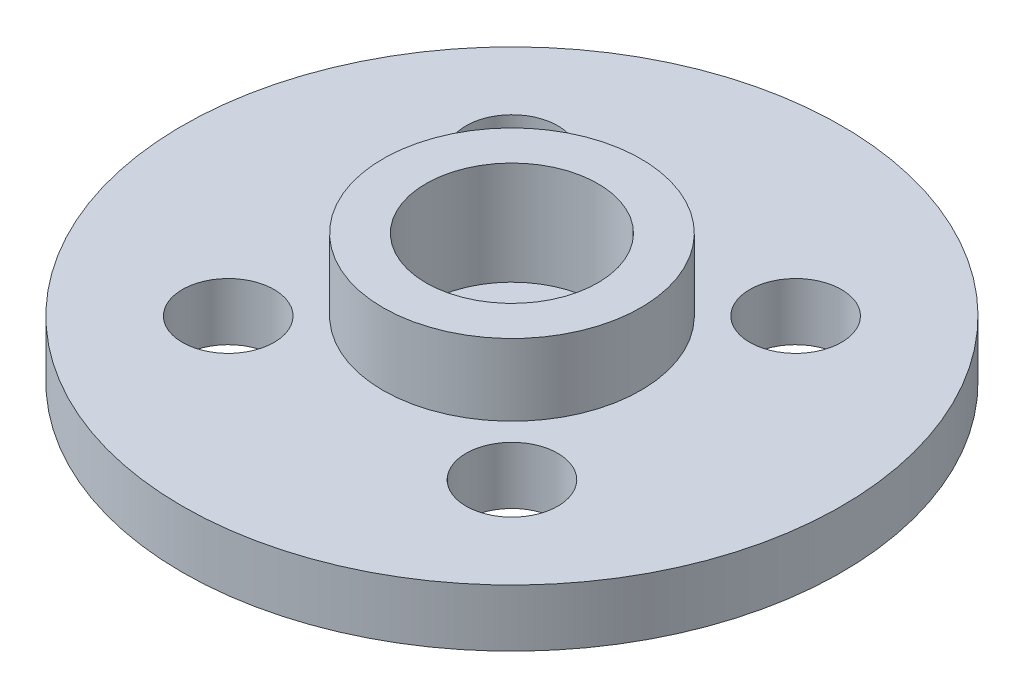
ISO-10303-21;
HEADER;
FILE_DESCRIPTION(('STEP AP214'),'2;1');
FILE_NAME('part.step','',(''),(''),'','','');
FILE_SCHEMA(('AUTOMOTIVE_DESIGN { 1 0 10303 214 1 1 1 1 }'));
ENDSEC;
DATA;
#1=APPLICATION_CONTEXT('core data for automotive mechanical design processes');
#2=APPLICATION_PROTOCOL_DEFINITION('international standard','automotive_design',2000,#1);
#3=PRODUCT_CONTEXT('',#1,'mechanical');
#4=PRODUCT('Part','Part','',(#3));
#5=PRODUCT_RELATED_PRODUCT_CATEGORY('part','',(#4));
#6=PRODUCT_DEFINITION_FORMATION('','',#4);
#7=PRODUCT_DEFINITION_CONTEXT('part definition',#1,'design');
#8=PRODUCT_DEFINITION('design','',#6,#7);
#9=PRODUCT_DEFINITION_SHAPE('','',#8);
#10=(LENGTH_UNIT() NAMED_UNIT(*) SI_UNIT(.MILLI.,.METRE.));
#11=(NAMED_UNIT(*) PLANE_ANGLE_UNIT() SI_UNIT($,.RADIAN.));
#12=(NAMED_UNIT(*) SI_UNIT($,.STERADIAN.) SOLID_ANGLE_UNIT());
#13=UNCERTAINTY_MEASURE_WITH_UNIT(LENGTH_MEASURE(1.E-05),#10,'distance_accuracy_value','');
#14=(GEOMETRIC_REPRESENTATION_CONTEXT(3) GLOBAL_UNCERTAINTY_ASSIGNED_CONTEXT((#13)) GLOBAL_UNIT_ASSIGNED_CONTEXT((#10,
#11,#12)) REPRESENTATION_CONTEXT('',''));
#15=CARTESIAN_POINT('',(0.,0.,0.));
#16=DIRECTION('',(0.,0.,1.));
#17=DIRECTION('',(1.,0.,0.));
#18=AXIS2_PLACEMENT_3D('',#15,#16,#17);
#19=CARTESIAN_POINT('',(0.,2.,0.));
#20=DIRECTION('',(0.,-1.,0.));
#21=DIRECTION('',(0.,0.,-1.));
#22=AXIS2_PLACEMENT_3D('',#19,#20,#21);
#23=CYLINDRICAL_SURFACE('',#22,1.6);
#24=CARTESIAN_POINT('',(0.,0.,0.));
#25=DIRECTION('',(0.,1.,0.));
#26=DIRECTION('',(0.,0.,1.));
#27=AXIS2_PLACEMENT_3D('',#24,#25,#26);
#28=CIRCLE('',#27,1.6);
#29=CARTESIAN_POINT('',(0.,0.,1.6));
#30=VERTEX_POINT('',#29);
#31=EDGE_CURVE('E73',#30,#30,#28,.T.);
#32=ORIENTED_EDGE('',*,*,#31,.F.);
#33=EDGE_LOOP('',(#32));
#34=FACE_BOUND('',#33,.T.);
#35=CARTESIAN_POINT('',(0.,0.900000000000001,0.));
#36=DIRECTION('',(0.,1.,0.));
#37=DIRECTION('',(0.,0.,1.));
#38=AXIS2_PLACEMENT_3D('',#35,#36,#37);
#39=CIRCLE('',#38,1.6);
#40=CARTESIAN_POINT('',(0.,0.900000000000001,1.6));
#41=VERTEX_POINT('',#40);
#42=EDGE_CURVE('E43',#41,#41,#39,.T.);
#43=ORIENTED_EDGE('',*,*,#42,.T.);
#44=EDGE_LOOP('',(#43));
#45=FACE_BOUND('',#44,.T.);
#46=ADVANCED_FACE('F39',(#34,#45),#23,.F.);
#47=CARTESIAN_POINT('',(0.,2.,0.));
#48=DIRECTION('',(0.,1.,0.));
#49=DIRECTION('',(0.,0.,1.));
#50=AXIS2_PLACEMENT_3D('',#47,#48,#49);
#51=PLANE('',#50);
#52=CARTESIAN_POINT('',(4.94974746830583,2.,4.94974746830583));
#53=DIRECTION('',(0.,1.,0.));
#54=DIRECTION('',(0.,0.,1.));
#55=AXIS2_PLACEMENT_3D('',#52,#53,#54);
#56=CIRCLE('',#55,1.6);
#57=CARTESIAN_POINT('',(4.94974746830583,2.,6.54974746830583));
#58=VERTEX_POINT('',#57);
#59=EDGE_CURVE('E62',#58,#58,#56,.T.);
#60=ORIENTED_EDGE('',*,*,#59,.F.);
#61=EDGE_LOOP('',(#60));
#62=FACE_BOUND('',#61,.T.);
#63=CARTESIAN_POINT('',(-4.94974746830583,2.,-4.94974746830583));
#64=DIRECTION('',(0.,1.,0.));
#65=DIRECTION('',(0.,0.,1.));
#66=AXIS2_PLACEMENT_3D('',#63,#64,#65);
#67=CIRCLE('',#66,1.6);
#68=CARTESIAN_POINT('',(-4.94974746830583,2.,-3.34974746830583));
#69=VERTEX_POINT('',#68);
#70=EDGE_CURVE('E55',#69,#69,#67,.T.);
#71=ORIENTED_EDGE('',*,*,#70,.F.);
#72=EDGE_LOOP('',(#71));
#73=FACE_BOUND('',#72,.T.);
#74=CARTESIAN_POINT('',(0.,2.,0.));
#75=DIRECTION('',(0.,1.,0.));
#76=DIRECTION('',(0.,0.,1.));
#77=AXIS2_PLACEMENT_3D('',#74,#75,#76);
#78=CIRCLE('',#77,11.5);
#79=CARTESIAN_POINT('',(0.,2.,11.5));
#80=VERTEX_POINT('',#79);
#81=EDGE_CURVE('E10',#80,#80,#78,.T.);
#82=ORIENTED_EDGE('',*,*,#81,.T.);
#83=EDGE_LOOP('',(#82));
#84=FACE_BOUND('',#83,.T.);
#85=CARTESIAN_POINT('',(4.94974746830583,2.,-4.94974746830583));
#86=DIRECTION('',(0.,1.,0.));
#87=DIRECTION('',(0.,0.,1.));
#88=AXIS2_PLACEMENT_3D('',#85,#86,#87);
#89=CIRCLE('',#88,1.6);
#90=CARTESIAN_POINT('',(4.94974746830583,2.,-3.34974746830583));
#91=VERTEX_POINT('',#90);
#92=EDGE_CURVE('E60',#91,#91,#89,.T.);
#93=ORIENTED_EDGE('',*,*,#92,.F.);
#94=EDGE_LOOP('',(#93));
#95=FACE_BOUND('',#94,.T.);
#96=CARTESIAN_POINT('',(-4.94974746830583,2.,4.94974746830583));
#97=DIRECTION('',(0.,1.,0.));
#98=DIRECTION('',(0.,0.,1.));
#99=AXIS2_PLACEMENT_3D('',#96,#97,#98);
#100=CIRCLE('',#99,1.6);
#101=CARTESIAN_POINT('',(-4.94974746830583,2.,6.54974746830583));
#102=VERTEX_POINT('',#101);
#103=EDGE_CURVE('E67',#102,#102,#100,.T.);
#104=ORIENTED_EDGE('',*,*,#103,.F.);
#105=EDGE_LOOP('',(#104));
#106=FACE_BOUND('',#105,.T.);
#107=CARTESIAN_POINT('',(0.,2.,0.));
#108=DIRECTION('',(0.,1.,0.));
#109=DIRECTION('',(0.,0.,1.));
#110=AXIS2_PLACEMENT_3D('',#107,#108,#109);
#111=CIRCLE('',#110,4.5);
#112=CARTESIAN_POINT('',(0.,2.,4.5));
#113=VERTEX_POINT('',#112);
#114=EDGE_CURVE('E81',#113,#113,#111,.T.);
#115=ORIENTED_EDGE('',*,*,#114,.F.);
#116=EDGE_LOOP('',(#115));
#117=FACE_BOUND('',#116,.T.);
#118=ADVANCED_FACE('F108',(#62,#73,#84,#95,#106,#117),#51,.T.);
#119=CARTESIAN_POINT('',(0.,0.,0.));
#120=DIRECTION('',(0.,1.,0.));
#121=DIRECTION('',(0.,0.,1.));
#122=AXIS2_PLACEMENT_3D('',#119,#120,#121);
#123=PLANE('',#122);
#124=CARTESIAN_POINT('',(0.,0.,0.));
#125=DIRECTION('',(0.,1.,0.));
#126=DIRECTION('',(0.,0.,1.));
#127=AXIS2_PLACEMENT_3D('',#124,#125,#126);
#128=CIRCLE('',#127,11.5);
#129=CARTESIAN_POINT('',(0.,0.,11.5));
#130=VERTEX_POINT('',#129);
#131=EDGE_CURVE('E50',#130,#130,#128,.T.);
#132=ORIENTED_EDGE('',*,*,#131,.F.);
#133=EDGE_LOOP('',(#132));
#134=FACE_BOUND('',#133,.T.);
#135=CARTESIAN_POINT('',(-4.94974746830583,0.,-4.94974746830583));
#136=DIRECTION('',(0.,1.,0.));
#137=DIRECTION('',(0.,0.,1.));
#138=AXIS2_PLACEMENT_3D('',#135,#136,#137);
#139=CIRCLE('',#138,1.6);
#140=CARTESIAN_POINT('',(-4.94974746830583,0.,-3.34974746830583));
#141=VERTEX_POINT('',#140);
#142=EDGE_CURVE('E53',#141,#141,#139,.T.);
#143=ORIENTED_EDGE('',*,*,#142,.T.);
#144=EDGE_LOOP('',(#143));
#145=FACE_BOUND('',#144,.T.);
#146=CARTESIAN_POINT('',(4.94974746830583,0.,-4.94974746830583));
#147=DIRECTION('',(0.,1.,0.));
#148=DIRECTION('',(0.,0.,1.));
#149=AXIS2_PLACEMENT_3D('',#146,#147,#148);
#150=CIRCLE('',#149,1.6);
#151=CARTESIAN_POINT('',(4.94974746830583,0.,-3.34974746830583));
#152=VERTEX_POINT('',#151);
#153=EDGE_CURVE('E58',#152,#152,#150,.T.);
#154=ORIENTED_EDGE('',*,*,#153,.T.);
#155=EDGE_LOOP('',(#154));
#156=FACE_BOUND('',#155,.T.);
#157=CARTESIAN_POINT('',(4.94974746830583,0.,4.94974746830583));
#158=DIRECTION('',(0.,1.,0.));
#159=DIRECTION('',(0.,0.,1.));
#160=AXIS2_PLACEMENT_3D('',#157,#158,#159);
#161=CIRCLE('',#160,1.6);
#162=CARTESIAN_POINT('',(4.94974746830583,0.,6.54974746830583));
#163=VERTEX_POINT('',#162);
#164=EDGE_CURVE('E68',#163,#163,#161,.T.);
#165=ORIENTED_EDGE('',*,*,#164,.T.);
#166=EDGE_LOOP('',(#165));
#167=FACE_BOUND('',#166,.T.);
#168=CARTESIAN_POINT('',(-4.94974746830583,0.,4.94974746830583));
#169=DIRECTION('',(0.,1.,0.));
#170=DIRECTION('',(0.,0.,1.));
#171=AXIS2_PLACEMENT_3D('',#168,#169,#170);
#172=CIRCLE('',#171,1.6);
#173=CARTESIAN_POINT('',(-4.94974746830583,0.,6.54974746830583));
#174=VERTEX_POINT('',#173);
#175=EDGE_CURVE('E75',#174,#174,#172,.T.);
#176=ORIENTED_EDGE('',*,*,#175,.T.);
#177=EDGE_LOOP('',(#176));
#178=FACE_BOUND('',#177,.T.);
#179=ORIENTED_EDGE('',*,*,#31,.T.);
#180=EDGE_LOOP('',(#179));
#181=FACE_BOUND('',#180,.T.);
#182=ADVANCED_FACE('F116',(#134,#145,#156,#167,#178,#181),#123,.F.);
#183=CARTESIAN_POINT('',(0.,2.,0.));
#184=DIRECTION('',(0.,-1.,0.));
#185=DIRECTION('',(0.,0.,-1.));
#186=AXIS2_PLACEMENT_3D('',#183,#184,#185);
#187=CYLINDRICAL_SURFACE('',#186,11.5);
#188=ORIENTED_EDGE('',*,*,#81,.F.);
#189=EDGE_LOOP('',(#188));
#190=FACE_BOUND('',#189,.T.);
#191=ORIENTED_EDGE('',*,*,#131,.T.);
#192=EDGE_LOOP('',(#191));
#193=FACE_BOUND('',#192,.T.);
#194=ADVANCED_FACE('F41',(#190,#193),#187,.T.);
#195=CARTESIAN_POINT('',(-4.94974746830583,2.,-4.94974746830583));
#196=DIRECTION('',(0.,-1.,0.));
#197=DIRECTION('',(0.,0.,-1.));
#198=AXIS2_PLACEMENT_3D('',#195,#196,#197);
#199=CYLINDRICAL_SURFACE('',#198,1.6);
#200=ORIENTED_EDGE('',*,*,#70,.T.);
#201=EDGE_LOOP('',(#200));
#202=FACE_BOUND('',#201,.T.);
#203=ORIENTED_EDGE('',*,*,#142,.F.);
#204=EDGE_LOOP('',(#203));
#205=FACE_BOUND('',#204,.T.);
#206=ADVANCED_FACE('F134',(#202,#205),#199,.F.);
#207=CARTESIAN_POINT('',(4.94974746830583,2.,-4.94974746830583));
#208=DIRECTION('',(0.,-1.,0.));
#209=DIRECTION('',(0.,0.,-1.));
#210=AXIS2_PLACEMENT_3D('',#207,#208,#209);
#211=CYLINDRICAL_SURFACE('',#210,1.6);
#212=ORIENTED_EDGE('',*,*,#92,.T.);
#213=EDGE_LOOP('',(#212));
#214=FACE_BOUND('',#213,.T.);
#215=ORIENTED_EDGE('',*,*,#153,.F.);
#216=EDGE_LOOP('',(#215));
#217=FACE_BOUND('',#216,.T.);
#218=ADVANCED_FACE('F133',(#214,#217),#211,.F.);
#219=CARTESIAN_POINT('',(4.94974746830583,2.,4.94974746830583));
#220=DIRECTION('',(0.,-1.,0.));
#221=DIRECTION('',(0.,0.,-1.));
#222=AXIS2_PLACEMENT_3D('',#219,#220,#221);
#223=CYLINDRICAL_SURFACE('',#222,1.6);
#224=ORIENTED_EDGE('',*,*,#59,.T.);
#225=EDGE_LOOP('',(#224));
#226=FACE_BOUND('',#225,.T.);
#227=ORIENTED_EDGE('',*,*,#164,.F.);
#228=EDGE_LOOP('',(#227));
#229=FACE_BOUND('',#228,.T.);
#230=ADVANCED_FACE('F130',(#226,#229),#223,.F.);
#231=CARTESIAN_POINT('',(-4.94974746830583,2.,4.94974746830583));
#232=DIRECTION('',(0.,-1.,0.));
#233=DIRECTION('',(0.,0.,-1.));
#234=AXIS2_PLACEMENT_3D('',#231,#232,#233);
#235=CYLINDRICAL_SURFACE('',#234,1.6);
#236=ORIENTED_EDGE('',*,*,#103,.T.);
#237=EDGE_LOOP('',(#236));
#238=FACE_BOUND('',#237,.T.);
#239=ORIENTED_EDGE('',*,*,#175,.F.);
#240=EDGE_LOOP('',(#239));
#241=FACE_BOUND('',#240,.T.);
#242=ADVANCED_FACE('F124',(#238,#241),#235,.F.);
#243=CARTESIAN_POINT('',(0.,4.5,0.));
#244=DIRECTION('',(0.,1.,0.));
#245=DIRECTION('',(0.,0.,1.));
#246=AXIS2_PLACEMENT_3D('',#243,#244,#245);
#247=PLANE('',#246);
#248=CARTESIAN_POINT('',(0.,4.5,0.));
#249=DIRECTION('',(0.,1.,0.));
#250=DIRECTION('',(0.,0.,1.));
#251=AXIS2_PLACEMENT_3D('',#248,#249,#250);
#252=CIRCLE('',#251,3.);
#253=CARTESIAN_POINT('',(0.,4.5,3.));
#254=VERTEX_POINT('',#253);
#255=EDGE_CURVE('E88',#254,#254,#252,.T.);
#256=ORIENTED_EDGE('',*,*,#255,.F.);
#257=EDGE_LOOP('',(#256));
#258=FACE_BOUND('',#257,.T.);
#259=CARTESIAN_POINT('',(0.,4.5,0.));
#260=DIRECTION('',(0.,1.,0.));
#261=DIRECTION('',(0.,0.,1.));
#262=AXIS2_PLACEMENT_3D('',#259,#260,#261);
#263=CIRCLE('',#262,4.5);
#264=CARTESIAN_POINT('',(0.,4.5,4.5));
#265=VERTEX_POINT('',#264);
#266=EDGE_CURVE('E78',#265,#265,#263,.T.);
#267=ORIENTED_EDGE('',*,*,#266,.T.);
#268=EDGE_LOOP('',(#267));
#269=FACE_BOUND('',#268,.T.);
#270=ADVANCED_FACE('F126',(#258,#269),#247,.T.);
#271=CARTESIAN_POINT('',(0.,4.5,0.));
#272=DIRECTION('',(0.,-1.,0.));
#273=DIRECTION('',(0.,0.,-1.));
#274=AXIS2_PLACEMENT_3D('',#271,#272,#273);
#275=CYLINDRICAL_SURFACE('',#274,4.5);
#276=ORIENTED_EDGE('',*,*,#266,.F.);
#277=EDGE_LOOP('',(#276));
#278=FACE_BOUND('',#277,.T.);
#279=ORIENTED_EDGE('',*,*,#114,.T.);
#280=EDGE_LOOP('',(#279));
#281=FACE_BOUND('',#280,.T.);
#282=ADVANCED_FACE('F104',(#278,#281),#275,.T.);
#283=CARTESIAN_POINT('',(0.,0.900000000000001,0.));
#284=DIRECTION('',(0.,1.,0.));
#285=DIRECTION('',(0.,0.,1.));
#286=AXIS2_PLACEMENT_3D('',#283,#284,#285);
#287=CYLINDRICAL_SURFACE('',#286,3.);
#288=CARTESIAN_POINT('',(0.,0.900000000000001,0.));
#289=DIRECTION('',(0.,1.,0.));
#290=DIRECTION('',(0.,0.,1.));
#291=AXIS2_PLACEMENT_3D('',#288,#289,#290);
#292=CIRCLE('',#291,3.);
#293=CARTESIAN_POINT('',(0.,0.900000000000001,3.));
#294=VERTEX_POINT('',#293);
#295=EDGE_CURVE('E87',#294,#294,#292,.T.);
#296=ORIENTED_EDGE('',*,*,#295,.F.);
#297=EDGE_LOOP('',(#296));
#298=FACE_BOUND('',#297,.T.);
#299=ORIENTED_EDGE('',*,*,#255,.T.);
#300=EDGE_LOOP('',(#299));
#301=FACE_BOUND('',#300,.T.);
#302=ADVANCED_FACE('F100',(#298,#301),#287,.F.);
#303=CARTESIAN_POINT('',(0.,0.900000000000001,0.));
#304=DIRECTION('',(0.,1.,0.));
#305=DIRECTION('',(0.,0.,1.));
#306=AXIS2_PLACEMENT_3D('',#303,#304,#305);
#307=PLANE('',#306);
#308=ORIENTED_EDGE('',*,*,#42,.F.);
#309=EDGE_LOOP('',(#308));
#310=FACE_BOUND('',#309,.T.);
#311=ORIENTED_EDGE('',*,*,#295,.T.);
#312=EDGE_LOOP('',(#311));
#313=FACE_BOUND('',#312,.T.);
#314=ADVANCED_FACE('F97',(#310,#313),#307,.T.);
#315=CLOSED_SHELL('',(#46,#118,#182,#194,#206,#218,#230,#242,#270,#282,#302,#314));
#316=MANIFOLD_SOLID_BREP('B2',#315);
#317=ADVANCED_BREP_SHAPE_REPRESENTATION('',(#18,#316),#14);
#318=SHAPE_DEFINITION_REPRESENTATION(#9,#317);
ENDSEC;
END-ISO-10303-21;
